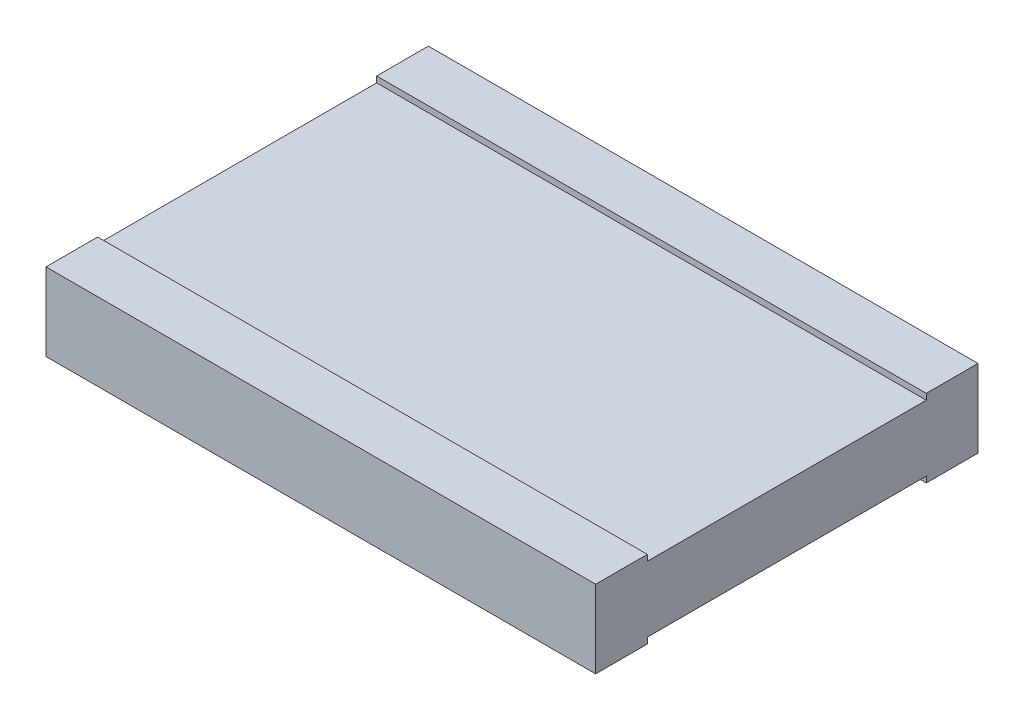
ISO-10303-21;
HEADER;
FILE_DESCRIPTION(('STEP AP214'),'2;1');
FILE_NAME('part.step','',(''),(''),'','','');
FILE_SCHEMA(('AUTOMOTIVE_DESIGN { 1 0 10303 214 1 1 1 1 }'));
ENDSEC;
DATA;
#1=APPLICATION_CONTEXT('core data for automotive mechanical design processes');
#2=APPLICATION_PROTOCOL_DEFINITION('international standard','automotive_design',2000,#1);
#3=PRODUCT_CONTEXT('',#1,'mechanical');
#4=PRODUCT('Part','Part','',(#3));
#5=PRODUCT_RELATED_PRODUCT_CATEGORY('part','',(#4));
#6=PRODUCT_DEFINITION_FORMATION('','',#4);
#7=PRODUCT_DEFINITION_CONTEXT('part definition',#1,'design');
#8=PRODUCT_DEFINITION('design','',#6,#7);
#9=PRODUCT_DEFINITION_SHAPE('','',#8);
#10=(LENGTH_UNIT() NAMED_UNIT(*) SI_UNIT(.MILLI.,.METRE.));
#11=(NAMED_UNIT(*) PLANE_ANGLE_UNIT() SI_UNIT($,.RADIAN.));
#12=(NAMED_UNIT(*) SI_UNIT($,.STERADIAN.) SOLID_ANGLE_UNIT());
#13=UNCERTAINTY_MEASURE_WITH_UNIT(LENGTH_MEASURE(1.E-05),#10,'distance_accuracy_value','');
#14=(GEOMETRIC_REPRESENTATION_CONTEXT(3) GLOBAL_UNCERTAINTY_ASSIGNED_CONTEXT((#13)) GLOBAL_UNIT_ASSIGNED_CONTEXT((#10,
#11,#12)) REPRESENTATION_CONTEXT('',''));
#15=CARTESIAN_POINT('',(0.,0.,0.));
#16=DIRECTION('',(0.,0.,1.));
#17=DIRECTION('',(1.,0.,0.));
#18=AXIS2_PLACEMENT_3D('',#15,#16,#17);
#19=CARTESIAN_POINT('',(-2.3,0.,1.6));
#20=DIRECTION('',(0.,1.,0.));
#21=DIRECTION('',(0.,0.,1.));
#22=AXIS2_PLACEMENT_3D('',#19,#20,#21);
#23=PLANE('',#22);
#24=DIRECTION('',(-1.,0.,0.));
#25=VECTOR('',#24,1.);
#26=CARTESIAN_POINT('',(-2.3,0.,-1.16720409019422));
#27=LINE('',#26,#25);
#28=CARTESIAN_POINT('',(2.3,0.,-1.16720409019422));
#29=VERTEX_POINT('',#28);
#30=CARTESIAN_POINT('',(-2.3,0.,-1.16720409019422));
#31=VERTEX_POINT('',#30);
#32=EDGE_CURVE('E147',#29,#31,#27,.T.);
#33=ORIENTED_EDGE('',*,*,#32,.T.);
#34=DIRECTION('',(0.,0.,1.));
#35=VECTOR('',#34,1.);
#36=CARTESIAN_POINT('',(-2.3,0.,1.6));
#37=LINE('',#36,#35);
#38=CARTESIAN_POINT('',(-2.3,0.,-1.6));
#39=VERTEX_POINT('',#38);
#40=EDGE_CURVE('E18',#39,#31,#37,.T.);
#41=ORIENTED_EDGE('',*,*,#40,.F.);
#42=DIRECTION('',(1.,0.,0.));
#43=VECTOR('',#42,1.);
#44=CARTESIAN_POINT('',(-2.3,0.,-1.6));
#45=LINE('',#44,#43);
#46=CARTESIAN_POINT('',(2.3,0.,-1.6));
#47=VERTEX_POINT('',#46);
#48=EDGE_CURVE('E153',#39,#47,#45,.T.);
#49=ORIENTED_EDGE('',*,*,#48,.T.);
#50=DIRECTION('',(0.,0.,1.));
#51=VECTOR('',#50,1.);
#52=CARTESIAN_POINT('',(2.3,0.,1.6));
#53=LINE('',#52,#51);
#54=EDGE_CURVE('E132',#29,#47,#53,.F.);
#55=ORIENTED_EDGE('',*,*,#54,.F.);
#56=EDGE_LOOP('',(#33,#41,#49,#55));
#57=FACE_BOUND('',#56,.T.);
#58=ADVANCED_FACE('F15',(#57),#23,.F.);
#59=CARTESIAN_POINT('',(-2.3,0.,1.6));
#60=DIRECTION('',(0.,1.,0.));
#61=DIRECTION('',(0.,0.,1.));
#62=AXIS2_PLACEMENT_3D('',#59,#60,#61);
#63=PLANE('',#62);
#64=DIRECTION('',(1.,0.,0.));
#65=VECTOR('',#64,1.);
#66=CARTESIAN_POINT('',(-2.3,0.,1.16720409019422));
#67=LINE('',#66,#65);
#68=CARTESIAN_POINT('',(-2.3,0.,1.16720409019422));
#69=VERTEX_POINT('',#68);
#70=CARTESIAN_POINT('',(2.3,0.,1.16720409019422));
#71=VERTEX_POINT('',#70);
#72=EDGE_CURVE('E159',#69,#71,#67,.T.);
#73=ORIENTED_EDGE('',*,*,#72,.T.);
#74=DIRECTION('',(0.,0.,1.));
#75=VECTOR('',#74,1.);
#76=CARTESIAN_POINT('',(2.3,0.,1.6));
#77=LINE('',#76,#75);
#78=CARTESIAN_POINT('',(2.3,0.,1.6));
#79=VERTEX_POINT('',#78);
#80=EDGE_CURVE('E100',#79,#71,#77,.F.);
#81=ORIENTED_EDGE('',*,*,#80,.F.);
#82=DIRECTION('',(-1.,0.,0.));
#83=VECTOR('',#82,1.);
#84=CARTESIAN_POINT('',(-2.3,0.,1.6));
#85=LINE('',#84,#83);
#86=CARTESIAN_POINT('',(-2.3,0.,1.6));
#87=VERTEX_POINT('',#86);
#88=EDGE_CURVE('E109',#79,#87,#85,.T.);
#89=ORIENTED_EDGE('',*,*,#88,.T.);
#90=DIRECTION('',(0.,0.,1.));
#91=VECTOR('',#90,1.);
#92=CARTESIAN_POINT('',(-2.3,0.,1.6));
#93=LINE('',#92,#91);
#94=EDGE_CURVE('E115',#69,#87,#93,.T.);
#95=ORIENTED_EDGE('',*,*,#94,.F.);
#96=EDGE_LOOP('',(#73,#81,#89,#95));
#97=FACE_BOUND('',#96,.T.);
#98=ADVANCED_FACE('F123',(#97),#63,.F.);
#99=CARTESIAN_POINT('',(-2.3,0.65,1.6));
#100=DIRECTION('',(0.,0.,-1.));
#101=DIRECTION('',(-1.,0.,0.));
#102=AXIS2_PLACEMENT_3D('',#99,#100,#101);
#103=PLANE('',#102);
#104=DIRECTION('',(0.,1.,0.));
#105=VECTOR('',#104,1.);
#106=CARTESIAN_POINT('',(2.3,0.65,1.6));
#107=LINE('',#106,#105);
#108=CARTESIAN_POINT('',(2.3,0.65,1.6));
#109=VERTEX_POINT('',#108);
#110=EDGE_CURVE('E114',#109,#79,#107,.F.);
#111=ORIENTED_EDGE('',*,*,#110,.F.);
#112=DIRECTION('',(1.,0.,0.));
#113=VECTOR('',#112,1.);
#114=CARTESIAN_POINT('',(-2.3,0.65,1.6));
#115=LINE('',#114,#113);
#116=CARTESIAN_POINT('',(-2.3,0.65,1.6));
#117=VERTEX_POINT('',#116);
#118=EDGE_CURVE('E112',#117,#109,#115,.T.);
#119=ORIENTED_EDGE('',*,*,#118,.F.);
#120=DIRECTION('',(0.,1.,0.));
#121=VECTOR('',#120,1.);
#122=CARTESIAN_POINT('',(-2.3,0.65,1.6));
#123=LINE('',#122,#121);
#124=EDGE_CURVE('E106',#87,#117,#123,.T.);
#125=ORIENTED_EDGE('',*,*,#124,.F.);
#126=ORIENTED_EDGE('',*,*,#88,.F.);
#127=EDGE_LOOP('',(#111,#119,#125,#126));
#128=FACE_BOUND('',#127,.T.);
#129=ADVANCED_FACE('F108',(#128),#103,.F.);
#130=CARTESIAN_POINT('',(-2.3,0.65,-1.6));
#131=DIRECTION('',(0.,0.,1.));
#132=DIRECTION('',(1.,0.,0.));
#133=AXIS2_PLACEMENT_3D('',#130,#131,#132);
#134=PLANE('',#133);
#135=DIRECTION('',(0.,1.,0.));
#136=VECTOR('',#135,1.);
#137=CARTESIAN_POINT('',(-2.3,0.65,-1.6));
#138=LINE('',#137,#136);
#139=CARTESIAN_POINT('',(-2.3,0.65,-1.6));
#140=VERTEX_POINT('',#139);
#141=EDGE_CURVE('E127',#140,#39,#138,.F.);
#142=ORIENTED_EDGE('',*,*,#141,.F.);
#143=DIRECTION('',(1.,0.,0.));
#144=VECTOR('',#143,1.);
#145=CARTESIAN_POINT('',(-2.3,0.65,-1.6));
#146=LINE('',#145,#144);
#147=CARTESIAN_POINT('',(2.3,0.65,-1.6));
#148=VERTEX_POINT('',#147);
#149=EDGE_CURVE('E170',#148,#140,#146,.F.);
#150=ORIENTED_EDGE('',*,*,#149,.F.);
#151=DIRECTION('',(0.,1.,0.));
#152=VECTOR('',#151,1.);
#153=CARTESIAN_POINT('',(2.3,0.65,-1.6));
#154=LINE('',#153,#152);
#155=EDGE_CURVE('E124',#47,#148,#154,.T.);
#156=ORIENTED_EDGE('',*,*,#155,.F.);
#157=ORIENTED_EDGE('',*,*,#48,.F.);
#158=EDGE_LOOP('',(#142,#150,#156,#157));
#159=FACE_BOUND('',#158,.T.);
#160=ADVANCED_FACE('F254',(#159),#134,.F.);
#161=CARTESIAN_POINT('',(-2.3,0.,-1.16720409019422));
#162=DIRECTION('',(0.,0.,-1.));
#163=DIRECTION('',(-1.,0.,0.));
#164=AXIS2_PLACEMENT_3D('',#161,#162,#163);
#165=PLANE('',#164);
#166=DIRECTION('',(1.,0.,0.));
#167=VECTOR('',#166,1.);
#168=CARTESIAN_POINT('',(-2.3,0.0499999999999997,-1.16720409019422));
#169=LINE('',#168,#167);
#170=CARTESIAN_POINT('',(2.3,0.0499999999999997,-1.16720409019422));
#171=VERTEX_POINT('',#170);
#172=CARTESIAN_POINT('',(-2.3,0.0499999999999998,-1.16720409019422));
#173=VERTEX_POINT('',#172);
#174=EDGE_CURVE('E149',#171,#173,#169,.F.);
#175=ORIENTED_EDGE('',*,*,#174,.T.);
#176=DIRECTION('',(0.,1.,0.));
#177=VECTOR('',#176,1.);
#178=CARTESIAN_POINT('',(-2.3,0.,-1.16720409019422));
#179=LINE('',#178,#177);
#180=EDGE_CURVE('E138',#31,#173,#179,.T.);
#181=ORIENTED_EDGE('',*,*,#180,.F.);
#182=ORIENTED_EDGE('',*,*,#32,.F.);
#183=DIRECTION('',(0.,1.,0.));
#184=VECTOR('',#183,1.);
#185=CARTESIAN_POINT('',(2.3,0.,-1.16720409019422));
#186=LINE('',#185,#184);
#187=EDGE_CURVE('E151',#171,#29,#186,.F.);
#188=ORIENTED_EDGE('',*,*,#187,.F.);
#189=EDGE_LOOP('',(#175,#181,#182,#188));
#190=FACE_BOUND('',#189,.T.);
#191=ADVANCED_FACE('F146',(#190),#165,.F.);
#192=CARTESIAN_POINT('',(-2.3,0.,1.16720409019422));
#193=DIRECTION('',(0.,0.,1.));
#194=DIRECTION('',(1.,0.,0.));
#195=AXIS2_PLACEMENT_3D('',#192,#193,#194);
#196=PLANE('',#195);
#197=ORIENTED_EDGE('',*,*,#72,.F.);
#198=DIRECTION('',(0.,1.,0.));
#199=VECTOR('',#198,1.);
#200=CARTESIAN_POINT('',(-2.3,0.,1.16720409019422));
#201=LINE('',#200,#199);
#202=CARTESIAN_POINT('',(-2.3,0.05,1.16720409019422));
#203=VERTEX_POINT('',#202);
#204=EDGE_CURVE('E120',#203,#69,#201,.F.);
#205=ORIENTED_EDGE('',*,*,#204,.F.);
#206=DIRECTION('',(1.,0.,0.));
#207=VECTOR('',#206,1.);
#208=CARTESIAN_POINT('',(-2.3,0.05,1.16720409019422));
#209=LINE('',#208,#207);
#210=CARTESIAN_POINT('',(2.3,0.0499999999999999,1.16720409019422));
#211=VERTEX_POINT('',#210);
#212=EDGE_CURVE('E174',#203,#211,#209,.T.);
#213=ORIENTED_EDGE('',*,*,#212,.T.);
#214=DIRECTION('',(0.,1.,0.));
#215=VECTOR('',#214,1.);
#216=CARTESIAN_POINT('',(2.3,0.,1.16720409019422));
#217=LINE('',#216,#215);
#218=EDGE_CURVE('E161',#71,#211,#217,.T.);
#219=ORIENTED_EDGE('',*,*,#218,.F.);
#220=EDGE_LOOP('',(#197,#205,#213,#219));
#221=FACE_BOUND('',#220,.T.);
#222=ADVANCED_FACE('F247',(#221),#196,.F.);
#223=CARTESIAN_POINT('',(-2.3,0.65,1.6));
#224=DIRECTION('',(0.,1.,0.));
#225=DIRECTION('',(0.,0.,1.));
#226=AXIS2_PLACEMENT_3D('',#223,#224,#225);
#227=PLANE('',#226);
#228=ORIENTED_EDGE('',*,*,#118,.T.);
#229=DIRECTION('',(0.,0.,1.));
#230=VECTOR('',#229,1.);
#231=CARTESIAN_POINT('',(2.3,0.65,1.6));
#232=LINE('',#231,#230);
#233=CARTESIAN_POINT('',(2.3,0.65,1.16720409019422));
#234=VERTEX_POINT('',#233);
#235=EDGE_CURVE('E166',#109,#234,#232,.F.);
#236=ORIENTED_EDGE('',*,*,#235,.T.);
#237=DIRECTION('',(1.,0.,0.));
#238=VECTOR('',#237,1.);
#239=CARTESIAN_POINT('',(-2.3,0.65,1.16720409019422));
#240=LINE('',#239,#238);
#241=CARTESIAN_POINT('',(-2.3,0.65,1.16720409019422));
#242=VERTEX_POINT('',#241);
#243=EDGE_CURVE('E177',#234,#242,#240,.F.);
#244=ORIENTED_EDGE('',*,*,#243,.T.);
#245=DIRECTION('',(0.,0.,1.));
#246=VECTOR('',#245,1.);
#247=CARTESIAN_POINT('',(-2.3,0.65,1.6));
#248=LINE('',#247,#246);
#249=EDGE_CURVE('E163',#242,#117,#248,.T.);
#250=ORIENTED_EDGE('',*,*,#249,.T.);
#251=EDGE_LOOP('',(#228,#236,#244,#250));
#252=FACE_BOUND('',#251,.T.);
#253=ADVANCED_FACE('F243',(#252),#227,.T.);
#254=CARTESIAN_POINT('',(-2.3,0.65,1.6));
#255=DIRECTION('',(0.,1.,0.));
#256=DIRECTION('',(0.,0.,1.));
#257=AXIS2_PLACEMENT_3D('',#254,#255,#256);
#258=PLANE('',#257);
#259=ORIENTED_EDGE('',*,*,#149,.T.);
#260=DIRECTION('',(0.,0.,-1.));
#261=VECTOR('',#260,1.);
#262=CARTESIAN_POINT('',(-2.3,0.65,-1.6));
#263=LINE('',#262,#261);
#264=CARTESIAN_POINT('',(-2.3,0.65,-1.16720409019422));
#265=VERTEX_POINT('',#264);
#266=EDGE_CURVE('E180',#140,#265,#263,.F.);
#267=ORIENTED_EDGE('',*,*,#266,.T.);
#268=DIRECTION('',(-1.,0.,0.));
#269=VECTOR('',#268,1.);
#270=CARTESIAN_POINT('',(-2.3,0.65,-1.16720409019422));
#271=LINE('',#270,#269);
#272=CARTESIAN_POINT('',(2.3,0.65,-1.16720409019422));
#273=VERTEX_POINT('',#272);
#274=EDGE_CURVE('E190',#265,#273,#271,.F.);
#275=ORIENTED_EDGE('',*,*,#274,.T.);
#276=DIRECTION('',(0.,0.,1.));
#277=VECTOR('',#276,1.);
#278=CARTESIAN_POINT('',(2.3,0.65,1.6));
#279=LINE('',#278,#277);
#280=EDGE_CURVE('E168',#273,#148,#279,.F.);
#281=ORIENTED_EDGE('',*,*,#280,.T.);
#282=EDGE_LOOP('',(#259,#267,#275,#281));
#283=FACE_BOUND('',#282,.T.);
#284=ADVANCED_FACE('F239',(#283),#258,.T.);
#285=CARTESIAN_POINT('',(-2.3,0.05,1.16720409019422));
#286=DIRECTION('',(0.,1.,0.));
#287=DIRECTION('',(0.,0.,1.));
#288=AXIS2_PLACEMENT_3D('',#285,#286,#287);
#289=PLANE('',#288);
#290=ORIENTED_EDGE('',*,*,#212,.F.);
#291=DIRECTION('',(0.,0.,-1.));
#292=VECTOR('',#291,1.);
#293=CARTESIAN_POINT('',(-2.3,0.05,-1.6));
#294=LINE('',#293,#292);
#295=EDGE_CURVE('E185',#203,#173,#294,.T.);
#296=ORIENTED_EDGE('',*,*,#295,.T.);
#297=ORIENTED_EDGE('',*,*,#174,.F.);
#298=DIRECTION('',(0.,0.,1.));
#299=VECTOR('',#298,1.);
#300=CARTESIAN_POINT('',(2.3,0.0499999999999997,-1.6));
#301=LINE('',#300,#299);
#302=EDGE_CURVE('E197',#171,#211,#301,.T.);
#303=ORIENTED_EDGE('',*,*,#302,.T.);
#304=EDGE_LOOP('',(#290,#296,#297,#303));
#305=FACE_BOUND('',#304,.T.);
#306=ADVANCED_FACE('F236',(#305),#289,.F.);
#307=CARTESIAN_POINT('',(-2.3,0.65,1.16720409019422));
#308=DIRECTION('',(0.,0.,1.));
#309=DIRECTION('',(1.,0.,0.));
#310=AXIS2_PLACEMENT_3D('',#307,#308,#309);
#311=PLANE('',#310);
#312=DIRECTION('',(1.,0.,0.));
#313=VECTOR('',#312,1.);
#314=CARTESIAN_POINT('',(-2.3,0.6,1.16720409019422));
#315=LINE('',#314,#313);
#316=CARTESIAN_POINT('',(2.3,0.6,1.16720409019422));
#317=VERTEX_POINT('',#316);
#318=CARTESIAN_POINT('',(-2.3,0.6,1.16720409019422));
#319=VERTEX_POINT('',#318);
#320=EDGE_CURVE('E200',#317,#319,#315,.F.);
#321=ORIENTED_EDGE('',*,*,#320,.T.);
#322=DIRECTION('',(0.,1.,0.));
#323=VECTOR('',#322,1.);
#324=CARTESIAN_POINT('',(-2.3,0.65,1.16720409019422));
#325=LINE('',#324,#323);
#326=EDGE_CURVE('E182',#319,#242,#325,.T.);
#327=ORIENTED_EDGE('',*,*,#326,.T.);
#328=ORIENTED_EDGE('',*,*,#243,.F.);
#329=DIRECTION('',(0.,1.,0.));
#330=VECTOR('',#329,1.);
#331=CARTESIAN_POINT('',(2.3,0.65,1.16720409019422));
#332=LINE('',#331,#330);
#333=EDGE_CURVE('E193',#234,#317,#332,.F.);
#334=ORIENTED_EDGE('',*,*,#333,.T.);
#335=EDGE_LOOP('',(#321,#327,#328,#334));
#336=FACE_BOUND('',#335,.T.);
#337=ADVANCED_FACE('F216',(#336),#311,.F.);
#338=CARTESIAN_POINT('',(-2.3,0.65,-1.6));
#339=DIRECTION('',(1.,0.,0.));
#340=DIRECTION('',(0.,0.,-1.));
#341=AXIS2_PLACEMENT_3D('',#338,#339,#340);
#342=PLANE('',#341);
#343=ORIENTED_EDGE('',*,*,#204,.T.);
#344=ORIENTED_EDGE('',*,*,#94,.T.);
#345=ORIENTED_EDGE('',*,*,#124,.T.);
#346=ORIENTED_EDGE('',*,*,#249,.F.);
#347=ORIENTED_EDGE('',*,*,#326,.F.);
#348=DIRECTION('',(0.,0.,-1.));
#349=VECTOR('',#348,1.);
#350=CARTESIAN_POINT('',(-2.3,0.6,1.16720409019422));
#351=LINE('',#350,#349);
#352=CARTESIAN_POINT('',(-2.3,0.6,-1.16720409019422));
#353=VERTEX_POINT('',#352);
#354=EDGE_CURVE('E203',#319,#353,#351,.T.);
#355=ORIENTED_EDGE('',*,*,#354,.T.);
#356=DIRECTION('',(0.,1.,0.));
#357=VECTOR('',#356,1.);
#358=CARTESIAN_POINT('',(-2.3,0.65,-1.16720409019422));
#359=LINE('',#358,#357);
#360=EDGE_CURVE('E187',#353,#265,#359,.T.);
#361=ORIENTED_EDGE('',*,*,#360,.T.);
#362=ORIENTED_EDGE('',*,*,#266,.F.);
#363=ORIENTED_EDGE('',*,*,#141,.T.);
#364=ORIENTED_EDGE('',*,*,#40,.T.);
#365=ORIENTED_EDGE('',*,*,#180,.T.);
#366=ORIENTED_EDGE('',*,*,#295,.F.);
#367=EDGE_LOOP('',(#343,#344,#345,#346,#347,#355,#361,#362,#363,#364,#365,#366));
#368=FACE_BOUND('',#367,.T.);
#369=ADVANCED_FACE('F118',(#368),#342,.F.);
#370=CARTESIAN_POINT('',(-2.3,0.65,-1.16720409019422));
#371=DIRECTION('',(0.,0.,-1.));
#372=DIRECTION('',(-1.,0.,0.));
#373=AXIS2_PLACEMENT_3D('',#370,#371,#372);
#374=PLANE('',#373);
#375=ORIENTED_EDGE('',*,*,#274,.F.);
#376=ORIENTED_EDGE('',*,*,#360,.F.);
#377=DIRECTION('',(1.,0.,0.));
#378=VECTOR('',#377,1.);
#379=CARTESIAN_POINT('',(-2.3,0.6,-1.16720409019422));
#380=LINE('',#379,#378);
#381=CARTESIAN_POINT('',(2.3,0.6,-1.16720409019422));
#382=VERTEX_POINT('',#381);
#383=EDGE_CURVE('E24',#353,#382,#380,.T.);
#384=ORIENTED_EDGE('',*,*,#383,.T.);
#385=DIRECTION('',(0.,1.,0.));
#386=VECTOR('',#385,1.);
#387=CARTESIAN_POINT('',(2.3,0.65,-1.16720409019422));
#388=LINE('',#387,#386);
#389=EDGE_CURVE('E32',#382,#273,#388,.T.);
#390=ORIENTED_EDGE('',*,*,#389,.T.);
#391=EDGE_LOOP('',(#375,#376,#384,#390));
#392=FACE_BOUND('',#391,.T.);
#393=ADVANCED_FACE('F210',(#392),#374,.F.);
#394=CARTESIAN_POINT('',(2.3,0.65,-1.6));
#395=DIRECTION('',(-1.,0.,0.));
#396=DIRECTION('',(0.,0.,1.));
#397=AXIS2_PLACEMENT_3D('',#394,#395,#396);
#398=PLANE('',#397);
#399=ORIENTED_EDGE('',*,*,#218,.T.);
#400=ORIENTED_EDGE('',*,*,#302,.F.);
#401=ORIENTED_EDGE('',*,*,#187,.T.);
#402=ORIENTED_EDGE('',*,*,#54,.T.);
#403=ORIENTED_EDGE('',*,*,#155,.T.);
#404=ORIENTED_EDGE('',*,*,#280,.F.);
#405=ORIENTED_EDGE('',*,*,#389,.F.);
#406=DIRECTION('',(0.,0.,-1.));
#407=VECTOR('',#406,1.);
#408=CARTESIAN_POINT('',(2.3,0.6,1.16720409019422));
#409=LINE('',#408,#407);
#410=EDGE_CURVE('E10',#382,#317,#409,.F.);
#411=ORIENTED_EDGE('',*,*,#410,.T.);
#412=ORIENTED_EDGE('',*,*,#333,.F.);
#413=ORIENTED_EDGE('',*,*,#235,.F.);
#414=ORIENTED_EDGE('',*,*,#110,.T.);
#415=ORIENTED_EDGE('',*,*,#80,.T.);
#416=EDGE_LOOP('',(#399,#400,#401,#402,#403,#404,#405,#411,#412,#413,#414,#415));
#417=FACE_BOUND('',#416,.T.);
#418=ADVANCED_FACE('F219',(#417),#398,.F.);
#419=CARTESIAN_POINT('',(-2.3,0.6,1.16720409019422));
#420=DIRECTION('',(0.,-1.,0.));
#421=DIRECTION('',(0.,0.,-1.));
#422=AXIS2_PLACEMENT_3D('',#419,#420,#421);
#423=PLANE('',#422);
#424=ORIENTED_EDGE('',*,*,#383,.F.);
#425=ORIENTED_EDGE('',*,*,#354,.F.);
#426=ORIENTED_EDGE('',*,*,#320,.F.);
#427=ORIENTED_EDGE('',*,*,#410,.F.);
#428=EDGE_LOOP('',(#424,#425,#426,#427));
#429=FACE_BOUND('',#428,.T.);
#430=ADVANCED_FACE('F213',(#429),#423,.F.);
#431=CLOSED_SHELL('',(#58,#98,#129,#160,#191,#222,#253,#284,#306,#337,#369,#393,#418,#430));
#432=MANIFOLD_SOLID_BREP('B1',#431);
#433=ADVANCED_BREP_SHAPE_REPRESENTATION('',(#18,#432),#14);
#434=SHAPE_DEFINITION_REPRESENTATION(#9,#433);
ENDSEC;
END-ISO-10303-21;
